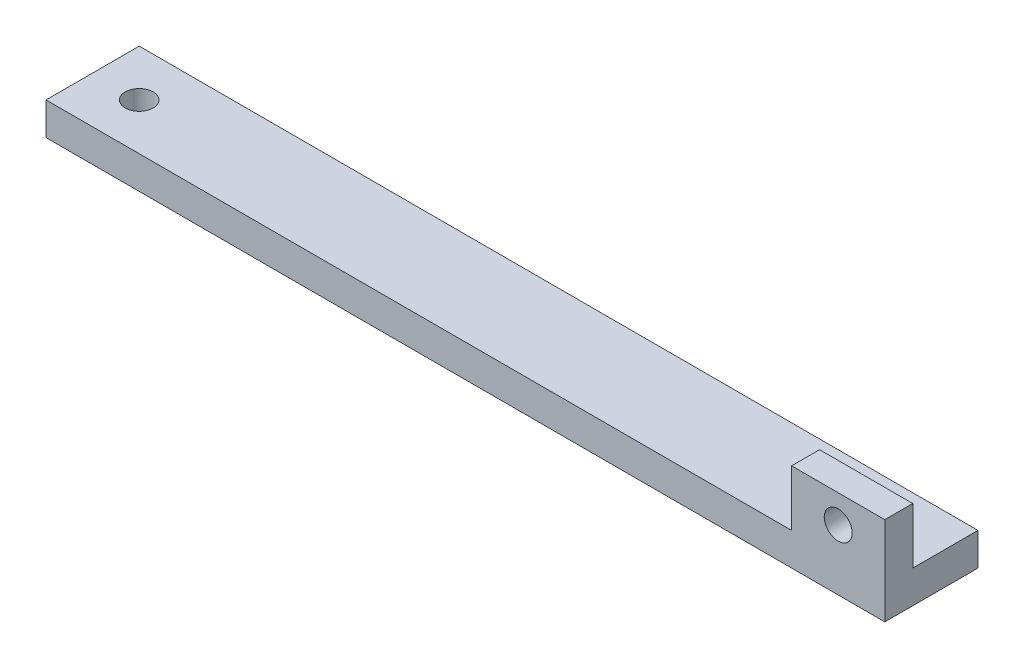
ISO-10303-21;
HEADER;
FILE_DESCRIPTION(('STEP AP214'),'2;1');
FILE_NAME('part.step','',(''),(''),'','','');
FILE_SCHEMA(('AUTOMOTIVE_DESIGN { 1 0 10303 214 1 1 1 1 }'));
ENDSEC;
DATA;
#1=APPLICATION_CONTEXT('core data for automotive mechanical design processes');
#2=APPLICATION_PROTOCOL_DEFINITION('international standard','automotive_design',2000,#1);
#3=PRODUCT_CONTEXT('',#1,'mechanical');
#4=PRODUCT('Part','Part','',(#3));
#5=PRODUCT_RELATED_PRODUCT_CATEGORY('part','',(#4));
#6=PRODUCT_DEFINITION_FORMATION('','',#4);
#7=PRODUCT_DEFINITION_CONTEXT('part definition',#1,'design');
#8=PRODUCT_DEFINITION('design','',#6,#7);
#9=PRODUCT_DEFINITION_SHAPE('','',#8);
#10=(LENGTH_UNIT() NAMED_UNIT(*) SI_UNIT(.MILLI.,.METRE.));
#11=(NAMED_UNIT(*) PLANE_ANGLE_UNIT() SI_UNIT($,.RADIAN.));
#12=(NAMED_UNIT(*) SI_UNIT($,.STERADIAN.) SOLID_ANGLE_UNIT());
#13=UNCERTAINTY_MEASURE_WITH_UNIT(LENGTH_MEASURE(1.E-05),#10,'distance_accuracy_value','');
#14=(GEOMETRIC_REPRESENTATION_CONTEXT(3) GLOBAL_UNCERTAINTY_ASSIGNED_CONTEXT((#13)) GLOBAL_UNIT_ASSIGNED_CONTEXT((#10,
#11,#12)) REPRESENTATION_CONTEXT('',''));
#15=CARTESIAN_POINT('',(0.,0.,0.));
#16=DIRECTION('',(0.,0.,1.));
#17=DIRECTION('',(1.,0.,0.));
#18=AXIS2_PLACEMENT_3D('',#15,#16,#17);
#19=CARTESIAN_POINT('',(0.,3.5,0.));
#20=DIRECTION('',(0.,1.,0.));
#21=DIRECTION('',(0.,0.,1.));
#22=AXIS2_PLACEMENT_3D('',#19,#20,#21);
#23=PLANE('',#22);
#24=DIRECTION('',(0.,0.,1.));
#25=VECTOR('',#24,1.);
#26=CARTESIAN_POINT('',(35.,3.5,5.));
#27=LINE('',#26,#25);
#28=CARTESIAN_POINT('',(35.,3.5,2.));
#29=VERTEX_POINT('',#28);
#30=CARTESIAN_POINT('',(35.,3.5,5.));
#31=VERTEX_POINT('',#30);
#32=EDGE_CURVE('E119',#29,#31,#27,.T.);
#33=ORIENTED_EDGE('',*,*,#32,.F.);
#34=DIRECTION('',(-1.,0.,0.));
#35=VECTOR('',#34,1.);
#36=CARTESIAN_POINT('',(45.,3.5,2.));
#37=LINE('',#36,#35);
#38=CARTESIAN_POINT('',(45.,3.5,2.));
#39=VERTEX_POINT('',#38);
#40=EDGE_CURVE('E61',#39,#29,#37,.T.);
#41=ORIENTED_EDGE('',*,*,#40,.F.);
#42=DIRECTION('',(0.,0.,-1.));
#43=VECTOR('',#42,1.);
#44=CARTESIAN_POINT('',(45.,3.5,-5.));
#45=LINE('',#44,#43);
#46=CARTESIAN_POINT('',(45.,3.5,-5.));
#47=VERTEX_POINT('',#46);
#48=EDGE_CURVE('E123',#39,#47,#45,.T.);
#49=ORIENTED_EDGE('',*,*,#48,.T.);
#50=DIRECTION('',(-1.,0.,0.));
#51=VECTOR('',#50,1.);
#52=CARTESIAN_POINT('',(-45.,3.5,-5.));
#53=LINE('',#52,#51);
#54=CARTESIAN_POINT('',(-45.,3.5,-5.));
#55=VERTEX_POINT('',#54);
#56=EDGE_CURVE('E142',#47,#55,#53,.T.);
#57=ORIENTED_EDGE('',*,*,#56,.T.);
#58=DIRECTION('',(0.,0.,1.));
#59=VECTOR('',#58,1.);
#60=CARTESIAN_POINT('',(-45.,3.5,-5.));
#61=LINE('',#60,#59);
#62=CARTESIAN_POINT('',(-45.,3.5,5.));
#63=VERTEX_POINT('',#62);
#64=EDGE_CURVE('E146',#55,#63,#61,.T.);
#65=ORIENTED_EDGE('',*,*,#64,.T.);
#66=DIRECTION('',(1.,0.,0.));
#67=VECTOR('',#66,1.);
#68=CARTESIAN_POINT('',(-45.,3.5,5.));
#69=LINE('',#68,#67);
#70=EDGE_CURVE('E55',#63,#31,#69,.T.);
#71=ORIENTED_EDGE('',*,*,#70,.T.);
#72=EDGE_LOOP('',(#33,#41,#49,#57,#65,#71));
#73=FACE_BOUND('',#72,.T.);
#74=CARTESIAN_POINT('',(-40.,3.5,0.));
#75=DIRECTION('',(0.,1.,0.));
#76=DIRECTION('',(0.,0.,1.));
#77=AXIS2_PLACEMENT_3D('',#74,#75,#76);
#78=CIRCLE('',#77,1.5);
#79=CARTESIAN_POINT('',(-40.,3.5,1.5));
#80=VERTEX_POINT('',#79);
#81=EDGE_CURVE('E130',#80,#80,#78,.T.);
#82=ORIENTED_EDGE('',*,*,#81,.F.);
#83=EDGE_LOOP('',(#82));
#84=FACE_BOUND('',#83,.T.);
#85=ADVANCED_FACE('F39',(#73,#84),#23,.T.);
#86=CARTESIAN_POINT('',(0.,0.,0.));
#87=DIRECTION('',(0.,1.,0.));
#88=DIRECTION('',(0.,0.,1.));
#89=AXIS2_PLACEMENT_3D('',#86,#87,#88);
#90=PLANE('',#89);
#91=DIRECTION('',(0.,0.,-1.));
#92=VECTOR('',#91,1.);
#93=CARTESIAN_POINT('',(45.,0.,-5.));
#94=LINE('',#93,#92);
#95=CARTESIAN_POINT('',(45.,0.,5.));
#96=VERTEX_POINT('',#95);
#97=CARTESIAN_POINT('',(45.,0.,-5.));
#98=VERTEX_POINT('',#97);
#99=EDGE_CURVE('E138',#96,#98,#94,.T.);
#100=ORIENTED_EDGE('',*,*,#99,.F.);
#101=DIRECTION('',(1.,0.,0.));
#102=VECTOR('',#101,1.);
#103=CARTESIAN_POINT('',(-45.,0.,5.));
#104=LINE('',#103,#102);
#105=CARTESIAN_POINT('',(-45.,0.,5.));
#106=VERTEX_POINT('',#105);
#107=EDGE_CURVE('E143',#106,#96,#104,.T.);
#108=ORIENTED_EDGE('',*,*,#107,.F.);
#109=DIRECTION('',(0.,0.,1.));
#110=VECTOR('',#109,1.);
#111=CARTESIAN_POINT('',(-45.,0.,-5.));
#112=LINE('',#111,#110);
#113=CARTESIAN_POINT('',(-45.,0.,-5.));
#114=VERTEX_POINT('',#113);
#115=EDGE_CURVE('E157',#114,#106,#112,.T.);
#116=ORIENTED_EDGE('',*,*,#115,.F.);
#117=DIRECTION('',(-1.,0.,0.));
#118=VECTOR('',#117,1.);
#119=CARTESIAN_POINT('',(-45.,0.,-5.));
#120=LINE('',#119,#118);
#121=EDGE_CURVE('E154',#98,#114,#120,.T.);
#122=ORIENTED_EDGE('',*,*,#121,.F.);
#123=EDGE_LOOP('',(#100,#108,#116,#122));
#124=FACE_BOUND('',#123,.T.);
#125=CARTESIAN_POINT('',(-40.,0.,0.));
#126=DIRECTION('',(0.,1.,0.));
#127=DIRECTION('',(0.,0.,1.));
#128=AXIS2_PLACEMENT_3D('',#125,#126,#127);
#129=CIRCLE('',#128,1.5);
#130=CARTESIAN_POINT('',(-40.,0.,1.5));
#131=VERTEX_POINT('',#130);
#132=EDGE_CURVE('E125',#131,#131,#129,.T.);
#133=ORIENTED_EDGE('',*,*,#132,.T.);
#134=EDGE_LOOP('',(#133));
#135=FACE_BOUND('',#134,.T.);
#136=ADVANCED_FACE('F180',(#124,#135),#90,.F.);
#137=CARTESIAN_POINT('',(45.,3.5,-5.));
#138=DIRECTION('',(-1.,0.,0.));
#139=DIRECTION('',(0.,0.,1.));
#140=AXIS2_PLACEMENT_3D('',#137,#138,#139);
#141=PLANE('',#140);
#142=ORIENTED_EDGE('',*,*,#99,.T.);
#143=DIRECTION('',(0.,-1.,0.));
#144=VECTOR('',#143,1.);
#145=CARTESIAN_POINT('',(45.,3.5,-5.));
#146=LINE('',#145,#144);
#147=EDGE_CURVE('E11',#47,#98,#146,.T.);
#148=ORIENTED_EDGE('',*,*,#147,.F.);
#149=ORIENTED_EDGE('',*,*,#48,.F.);
#150=DIRECTION('',(0.,-1.,0.));
#151=VECTOR('',#150,1.);
#152=CARTESIAN_POINT('',(45.,9.5,2.));
#153=LINE('',#152,#151);
#154=CARTESIAN_POINT('',(45.,9.5,2.));
#155=VERTEX_POINT('',#154);
#156=EDGE_CURVE('E102',#155,#39,#153,.T.);
#157=ORIENTED_EDGE('',*,*,#156,.F.);
#158=DIRECTION('',(0.,0.,-1.));
#159=VECTOR('',#158,1.);
#160=CARTESIAN_POINT('',(45.,9.5,5.));
#161=LINE('',#160,#159);
#162=CARTESIAN_POINT('',(45.,9.5,5.));
#163=VERTEX_POINT('',#162);
#164=EDGE_CURVE('E109',#163,#155,#161,.T.);
#165=ORIENTED_EDGE('',*,*,#164,.F.);
#166=DIRECTION('',(0.,-1.,0.));
#167=VECTOR('',#166,1.);
#168=CARTESIAN_POINT('',(45.,3.5,5.));
#169=LINE('',#168,#167);
#170=EDGE_CURVE('E151',#163,#96,#169,.T.);
#171=ORIENTED_EDGE('',*,*,#170,.T.);
#172=EDGE_LOOP('',(#142,#148,#149,#157,#165,#171));
#173=FACE_BOUND('',#172,.T.);
#174=ADVANCED_FACE('F41',(#173),#141,.F.);
#175=CARTESIAN_POINT('',(-45.,3.5,-5.));
#176=DIRECTION('',(0.,0.,1.));
#177=DIRECTION('',(1.,0.,0.));
#178=AXIS2_PLACEMENT_3D('',#175,#176,#177);
#179=PLANE('',#178);
#180=ORIENTED_EDGE('',*,*,#121,.T.);
#181=DIRECTION('',(0.,-1.,0.));
#182=VECTOR('',#181,1.);
#183=CARTESIAN_POINT('',(-45.,3.5,-5.));
#184=LINE('',#183,#182);
#185=EDGE_CURVE('E48',#55,#114,#184,.T.);
#186=ORIENTED_EDGE('',*,*,#185,.F.);
#187=ORIENTED_EDGE('',*,*,#56,.F.);
#188=ORIENTED_EDGE('',*,*,#147,.T.);
#189=EDGE_LOOP('',(#180,#186,#187,#188));
#190=FACE_BOUND('',#189,.T.);
#191=ADVANCED_FACE('F184',(#190),#179,.F.);
#192=CARTESIAN_POINT('',(-45.,3.5,-5.));
#193=DIRECTION('',(1.,0.,0.));
#194=DIRECTION('',(0.,0.,-1.));
#195=AXIS2_PLACEMENT_3D('',#192,#193,#194);
#196=PLANE('',#195);
#197=ORIENTED_EDGE('',*,*,#115,.T.);
#198=DIRECTION('',(0.,-1.,0.));
#199=VECTOR('',#198,1.);
#200=CARTESIAN_POINT('',(-45.,3.5,5.));
#201=LINE('',#200,#199);
#202=EDGE_CURVE('E164',#63,#106,#201,.T.);
#203=ORIENTED_EDGE('',*,*,#202,.F.);
#204=ORIENTED_EDGE('',*,*,#64,.F.);
#205=ORIENTED_EDGE('',*,*,#185,.T.);
#206=EDGE_LOOP('',(#197,#203,#204,#205));
#207=FACE_BOUND('',#206,.T.);
#208=ADVANCED_FACE('F173',(#207),#196,.F.);
#209=CARTESIAN_POINT('',(-45.,3.5,5.));
#210=DIRECTION('',(0.,0.,-1.));
#211=DIRECTION('',(-1.,0.,0.));
#212=AXIS2_PLACEMENT_3D('',#209,#210,#211);
#213=PLANE('',#212);
#214=CARTESIAN_POINT('',(40.,6.5,5.));
#215=DIRECTION('',(0.,0.,-1.));
#216=DIRECTION('',(-1.,0.,0.));
#217=AXIS2_PLACEMENT_3D('',#214,#215,#216);
#218=CIRCLE('',#217,1.5);
#219=CARTESIAN_POINT('',(38.5,6.5,5.));
#220=VERTEX_POINT('',#219);
#221=EDGE_CURVE('E196',#220,#220,#218,.T.);
#222=ORIENTED_EDGE('',*,*,#221,.T.);
#223=EDGE_LOOP('',(#222));
#224=FACE_BOUND('',#223,.T.);
#225=ORIENTED_EDGE('',*,*,#107,.T.);
#226=ORIENTED_EDGE('',*,*,#170,.F.);
#227=DIRECTION('',(1.,0.,0.));
#228=VECTOR('',#227,1.);
#229=CARTESIAN_POINT('',(45.,9.5,5.));
#230=LINE('',#229,#228);
#231=CARTESIAN_POINT('',(35.,9.5,5.));
#232=VERTEX_POINT('',#231);
#233=EDGE_CURVE('E115',#232,#163,#230,.T.);
#234=ORIENTED_EDGE('',*,*,#233,.F.);
#235=DIRECTION('',(0.,-1.,0.));
#236=VECTOR('',#235,1.);
#237=CARTESIAN_POINT('',(35.,9.5,5.));
#238=LINE('',#237,#236);
#239=EDGE_CURVE('E132',#232,#31,#238,.T.);
#240=ORIENTED_EDGE('',*,*,#239,.T.);
#241=ORIENTED_EDGE('',*,*,#70,.F.);
#242=ORIENTED_EDGE('',*,*,#202,.T.);
#243=EDGE_LOOP('',(#225,#226,#234,#240,#241,#242));
#244=FACE_BOUND('',#243,.T.);
#245=ADVANCED_FACE('F183',(#224,#244),#213,.F.);
#246=CARTESIAN_POINT('',(-40.,3.5,0.));
#247=DIRECTION('',(0.,-1.,0.));
#248=DIRECTION('',(0.,0.,-1.));
#249=AXIS2_PLACEMENT_3D('',#246,#247,#248);
#250=CYLINDRICAL_SURFACE('',#249,1.5);
#251=ORIENTED_EDGE('',*,*,#81,.T.);
#252=EDGE_LOOP('',(#251));
#253=FACE_BOUND('',#252,.T.);
#254=ORIENTED_EDGE('',*,*,#132,.F.);
#255=EDGE_LOOP('',(#254));
#256=FACE_BOUND('',#255,.T.);
#257=ADVANCED_FACE('F217',(#253,#256),#250,.F.);
#258=CARTESIAN_POINT('',(45.,9.5,2.));
#259=DIRECTION('',(0.,0.,1.));
#260=DIRECTION('',(1.,0.,0.));
#261=AXIS2_PLACEMENT_3D('',#258,#259,#260);
#262=PLANE('',#261);
#263=CARTESIAN_POINT('',(40.,6.5,2.));
#264=DIRECTION('',(0.,0.,-1.));
#265=DIRECTION('',(-1.,0.,0.));
#266=AXIS2_PLACEMENT_3D('',#263,#264,#265);
#267=CIRCLE('',#266,1.5);
#268=CARTESIAN_POINT('',(38.5,6.5,2.));
#269=VERTEX_POINT('',#268);
#270=EDGE_CURVE('E200',#269,#269,#267,.T.);
#271=ORIENTED_EDGE('',*,*,#270,.F.);
#272=EDGE_LOOP('',(#271));
#273=FACE_BOUND('',#272,.T.);
#274=ORIENTED_EDGE('',*,*,#40,.T.);
#275=DIRECTION('',(0.,-1.,0.));
#276=VECTOR('',#275,1.);
#277=CARTESIAN_POINT('',(35.,9.5,2.));
#278=LINE('',#277,#276);
#279=CARTESIAN_POINT('',(35.,9.5,2.));
#280=VERTEX_POINT('',#279);
#281=EDGE_CURVE('E104',#280,#29,#278,.T.);
#282=ORIENTED_EDGE('',*,*,#281,.F.);
#283=DIRECTION('',(-1.,0.,0.));
#284=VECTOR('',#283,1.);
#285=CARTESIAN_POINT('',(45.,9.5,2.));
#286=LINE('',#285,#284);
#287=EDGE_CURVE('E98',#155,#280,#286,.T.);
#288=ORIENTED_EDGE('',*,*,#287,.F.);
#289=ORIENTED_EDGE('',*,*,#156,.T.);
#290=EDGE_LOOP('',(#274,#282,#288,#289));
#291=FACE_BOUND('',#290,.T.);
#292=ADVANCED_FACE('F100',(#273,#291),#262,.F.);
#293=CARTESIAN_POINT('',(35.,9.5,5.));
#294=DIRECTION('',(1.,0.,0.));
#295=DIRECTION('',(0.,0.,-1.));
#296=AXIS2_PLACEMENT_3D('',#293,#294,#295);
#297=PLANE('',#296);
#298=ORIENTED_EDGE('',*,*,#32,.T.);
#299=ORIENTED_EDGE('',*,*,#239,.F.);
#300=DIRECTION('',(0.,0.,1.));
#301=VECTOR('',#300,1.);
#302=CARTESIAN_POINT('',(35.,9.5,5.));
#303=LINE('',#302,#301);
#304=EDGE_CURVE('E108',#280,#232,#303,.T.);
#305=ORIENTED_EDGE('',*,*,#304,.F.);
#306=ORIENTED_EDGE('',*,*,#281,.T.);
#307=EDGE_LOOP('',(#298,#299,#305,#306));
#308=FACE_BOUND('',#307,.T.);
#309=ADVANCED_FACE('F216',(#308),#297,.F.);
#310=CARTESIAN_POINT('',(0.,9.5,0.));
#311=DIRECTION('',(0.,1.,0.));
#312=DIRECTION('',(0.,0.,1.));
#313=AXIS2_PLACEMENT_3D('',#310,#311,#312);
#314=PLANE('',#313);
#315=ORIENTED_EDGE('',*,*,#164,.T.);
#316=ORIENTED_EDGE('',*,*,#287,.T.);
#317=ORIENTED_EDGE('',*,*,#304,.T.);
#318=ORIENTED_EDGE('',*,*,#233,.T.);
#319=EDGE_LOOP('',(#315,#316,#317,#318));
#320=FACE_BOUND('',#319,.T.);
#321=ADVANCED_FACE('F113',(#320),#314,.T.);
#322=CARTESIAN_POINT('',(40.,6.5,5.));
#323=DIRECTION('',(0.,0.,-1.));
#324=DIRECTION('',(-1.,0.,0.));
#325=AXIS2_PLACEMENT_3D('',#322,#323,#324);
#326=CYLINDRICAL_SURFACE('',#325,1.5);
#327=ORIENTED_EDGE('',*,*,#221,.F.);
#328=EDGE_LOOP('',(#327));
#329=FACE_BOUND('',#328,.T.);
#330=ORIENTED_EDGE('',*,*,#270,.T.);
#331=EDGE_LOOP('',(#330));
#332=FACE_BOUND('',#331,.T.);
#333=ADVANCED_FACE('F209',(#329,#332),#326,.F.);
#334=CLOSED_SHELL('',(#85,#136,#174,#191,#208,#245,#257,#292,#309,#321,#333));
#335=MANIFOLD_SOLID_BREP('B2',#334);
#336=ADVANCED_BREP_SHAPE_REPRESENTATION('',(#18,#335),#14);
#337=SHAPE_DEFINITION_REPRESENTATION(#9,#336);
ENDSEC;
END-ISO-10303-21;
